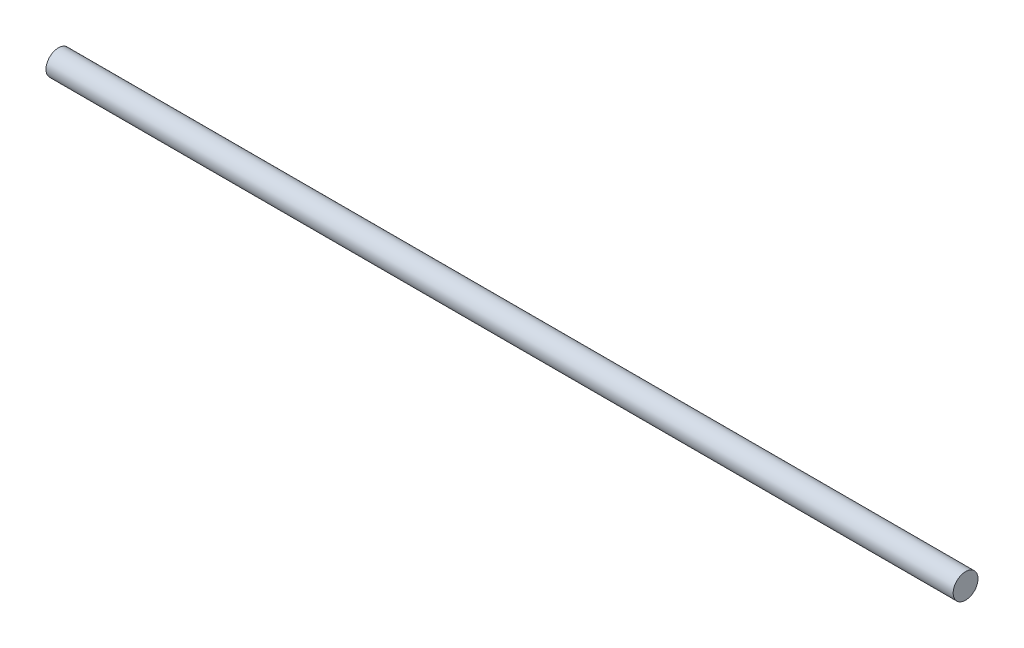
ISO-10303-21;
HEADER;
FILE_DESCRIPTION(('STEP AP214'),'2;1');
FILE_NAME('part.step','',(''),(''),'','','');
FILE_SCHEMA(('AUTOMOTIVE_DESIGN { 1 0 10303 214 1 1 1 1 }'));
ENDSEC;
DATA;
#1=APPLICATION_CONTEXT('core data for automotive mechanical design processes');
#2=APPLICATION_PROTOCOL_DEFINITION('international standard','automotive_design',2000,#1);
#3=PRODUCT_CONTEXT('',#1,'mechanical');
#4=PRODUCT('Part','Part','',(#3));
#5=PRODUCT_RELATED_PRODUCT_CATEGORY('part','',(#4));
#6=PRODUCT_DEFINITION_FORMATION('','',#4);
#7=PRODUCT_DEFINITION_CONTEXT('part definition',#1,'design');
#8=PRODUCT_DEFINITION('design','',#6,#7);
#9=PRODUCT_DEFINITION_SHAPE('','',#8);
#10=(LENGTH_UNIT() NAMED_UNIT(*) SI_UNIT(.MILLI.,.METRE.));
#11=(NAMED_UNIT(*) PLANE_ANGLE_UNIT() SI_UNIT($,.RADIAN.));
#12=(NAMED_UNIT(*) SI_UNIT($,.STERADIAN.) SOLID_ANGLE_UNIT());
#13=UNCERTAINTY_MEASURE_WITH_UNIT(LENGTH_MEASURE(1.E-05),#10,'distance_accuracy_value','');
#14=(GEOMETRIC_REPRESENTATION_CONTEXT(3) GLOBAL_UNCERTAINTY_ASSIGNED_CONTEXT((#13)) GLOBAL_UNIT_ASSIGNED_CONTEXT((#10,
#11,#12)) REPRESENTATION_CONTEXT('',''));
#15=CARTESIAN_POINT('',(0.,0.,0.));
#16=DIRECTION('',(0.,0.,1.));
#17=DIRECTION('',(1.,0.,0.));
#18=AXIS2_PLACEMENT_3D('',#15,#16,#17);
#19=CARTESIAN_POINT('',(174.07800016,0.,0.));
#20=DIRECTION('',(-1.,0.,0.));
#21=DIRECTION('',(0.,0.,1.));
#22=AXIS2_PLACEMENT_3D('',#19,#20,#21);
#23=CYLINDRICAL_SURFACE('',#22,2.38125);
#24=CARTESIAN_POINT('',(174.07800016,0.,0.));
#25=DIRECTION('',(1.,0.,0.));
#26=DIRECTION('',(0.,0.,-1.));
#27=AXIS2_PLACEMENT_3D('',#24,#25,#26);
#28=CIRCLE('',#27,2.38125);
#29=CARTESIAN_POINT('',(174.07800016,0.,-2.38125));
#30=VERTEX_POINT('',#29);
#31=EDGE_CURVE('E10',#30,#30,#28,.T.);
#32=ORIENTED_EDGE('',*,*,#31,.F.);
#33=EDGE_LOOP('',(#32));
#34=FACE_BOUND('',#33,.T.);
#35=CARTESIAN_POINT('',(0.,0.,0.));
#36=DIRECTION('',(1.,0.,0.));
#37=DIRECTION('',(0.,0.,-1.));
#38=AXIS2_PLACEMENT_3D('',#35,#36,#37);
#39=CIRCLE('',#38,2.38125);
#40=CARTESIAN_POINT('',(0.,0.,-2.38125));
#41=VERTEX_POINT('',#40);
#42=EDGE_CURVE('E46',#41,#41,#39,.T.);
#43=ORIENTED_EDGE('',*,*,#42,.T.);
#44=EDGE_LOOP('',(#43));
#45=FACE_BOUND('',#44,.T.);
#46=ADVANCED_FACE('F43',(#34,#45),#23,.T.);
#47=CARTESIAN_POINT('',(174.07800016,0.,0.));
#48=DIRECTION('',(1.,0.,0.));
#49=DIRECTION('',(0.,0.,-1.));
#50=AXIS2_PLACEMENT_3D('',#47,#48,#49);
#51=PLANE('',#50);
#52=ORIENTED_EDGE('',*,*,#31,.T.);
#53=EDGE_LOOP('',(#52));
#54=FACE_BOUND('',#53,.T.);
#55=ADVANCED_FACE('F58',(#54),#51,.T.);
#56=CARTESIAN_POINT('',(0.,0.,0.));
#57=DIRECTION('',(1.,0.,0.));
#58=DIRECTION('',(0.,0.,-1.));
#59=AXIS2_PLACEMENT_3D('',#56,#57,#58);
#60=PLANE('',#59);
#61=ORIENTED_EDGE('',*,*,#42,.F.);
#62=EDGE_LOOP('',(#61));
#63=FACE_BOUND('',#62,.T.);
#64=ADVANCED_FACE('F56',(#63),#60,.F.);
#65=CLOSED_SHELL('',(#46,#55,#64));
#66=MANIFOLD_SOLID_BREP('B2',#65);
#67=ADVANCED_BREP_SHAPE_REPRESENTATION('',(#18,#66),#14);
#68=SHAPE_DEFINITION_REPRESENTATION(#9,#67);
ENDSEC;
END-ISO-10303-21;
